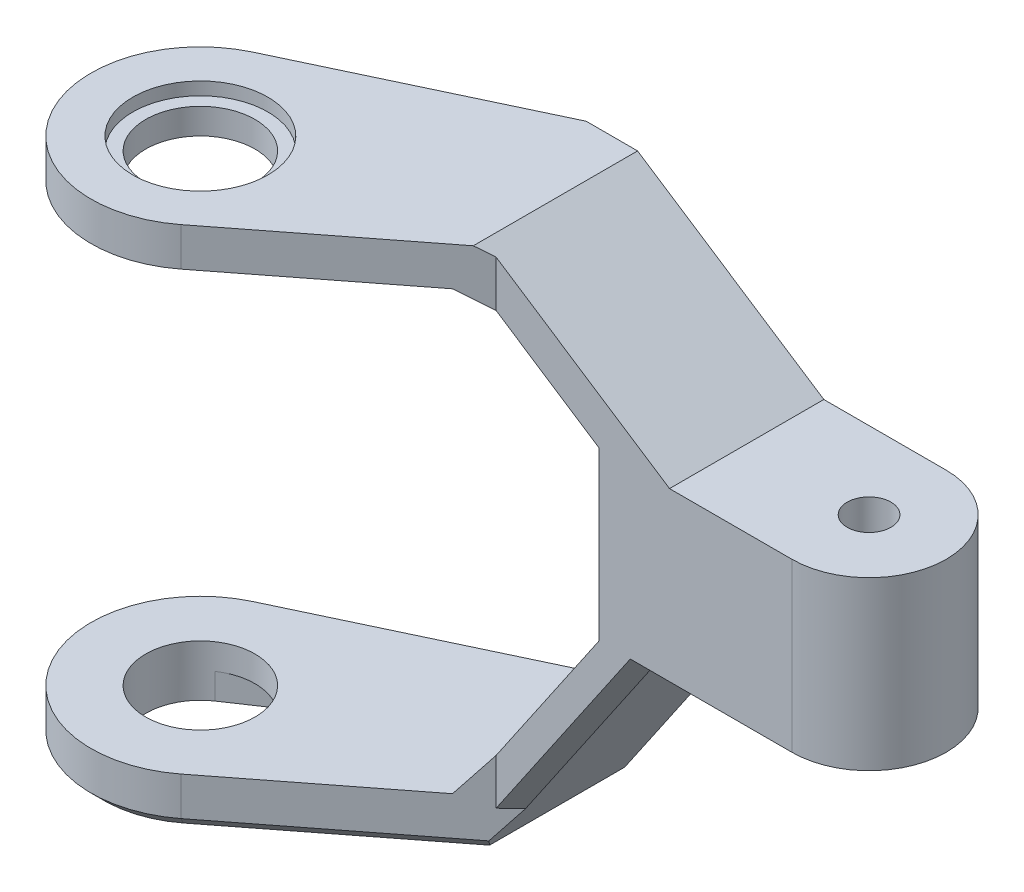
ISO-10303-21;
HEADER;
FILE_DESCRIPTION(('STEP AP214'),'2;1');
FILE_NAME('part.step','',(''),(''),'','','');
FILE_SCHEMA(('AUTOMOTIVE_DESIGN { 1 0 10303 214 1 1 1 1 }'));
ENDSEC;
DATA;
#1=APPLICATION_CONTEXT('core data for automotive mechanical design processes');
#2=APPLICATION_PROTOCOL_DEFINITION('international standard','automotive_design',2000,#1);
#3=PRODUCT_CONTEXT('',#1,'mechanical');
#4=PRODUCT('Part','Part','',(#3));
#5=PRODUCT_RELATED_PRODUCT_CATEGORY('part','',(#4));
#6=PRODUCT_DEFINITION_FORMATION('','',#4);
#7=PRODUCT_DEFINITION_CONTEXT('part definition',#1,'design');
#8=PRODUCT_DEFINITION('design','',#6,#7);
#9=PRODUCT_DEFINITION_SHAPE('','',#8);
#10=(LENGTH_UNIT() NAMED_UNIT(*) SI_UNIT(.MILLI.,.METRE.));
#11=(NAMED_UNIT(*) PLANE_ANGLE_UNIT() SI_UNIT($,.RADIAN.));
#12=(NAMED_UNIT(*) SI_UNIT($,.STERADIAN.) SOLID_ANGLE_UNIT());
#13=UNCERTAINTY_MEASURE_WITH_UNIT(LENGTH_MEASURE(1.E-05),#10,'distance_accuracy_value','');
#14=(GEOMETRIC_REPRESENTATION_CONTEXT(3) GLOBAL_UNCERTAINTY_ASSIGNED_CONTEXT((#13)) GLOBAL_UNIT_ASSIGNED_CONTEXT((#10,
#11,#12)) REPRESENTATION_CONTEXT('',''));
#15=CARTESIAN_POINT('',(0.,0.,0.));
#16=DIRECTION('',(0.,0.,1.));
#17=DIRECTION('',(1.,0.,0.));
#18=AXIS2_PLACEMENT_3D('',#15,#16,#17);
#19=CARTESIAN_POINT('',(49.900014042132,-49.,10.106834169285));
#20=DIRECTION('',(0.,1.,0.));
#21=DIRECTION('',(0.,0.,1.));
#22=AXIS2_PLACEMENT_3D('',#19,#20,#21);
#23=PLANE('',#22);
#24=DIRECTION('',(0.829311361307915,0.,-0.558786780449943));
#25=VECTOR('',#24,1.);
#26=CARTESIAN_POINT('',(44.625156285237,-49.,3.475426645614));
#27=LINE('',#26,#25);
#28=CARTESIAN_POINT('',(60.3328906864063,-49.,-7.10838390335701));
#29=VERTEX_POINT('',#28);
#30=CARTESIAN_POINT('',(44.6251562341624,-49.,3.47542668002775));
#31=VERTEX_POINT('',#30);
#32=EDGE_CURVE('E101',#29,#31,#27,.F.);
#33=ORIENTED_EDGE('',*,*,#32,.F.);
#34=CARTESIAN_POINT('',(61.869554980204,-49.,-4.827778096105));
#35=DIRECTION('',(0.,1.,0.));
#36=DIRECTION('',(0.,0.,1.));
#37=AXIS2_PLACEMENT_3D('',#34,#35,#36);
#38=CIRCLE('',#37,2.75);
#39=CARTESIAN_POINT('',(63.7460363501863,-49.,-2.81747521640199));
#40=VERTEX_POINT('',#39);
#41=EDGE_CURVE('E18',#29,#40,#38,.F.);
#42=ORIENTED_EDGE('',*,*,#41,.T.);
#43=DIRECTION('',(0.73101957657582,0.,-0.682356489426831));
#44=VECTOR('',#43,1.);
#45=CARTESIAN_POINT('',(49.900014042132,-49.,10.106834169271));
#46=LINE('',#45,#44);
#47=CARTESIAN_POINT('',(49.9000145610962,-49.,10.1068336848607));
#48=VERTEX_POINT('',#47);
#49=EDGE_CURVE('E105',#40,#48,#46,.F.);
#50=ORIENTED_EDGE('',*,*,#49,.T.);
#51=CARTESIAN_POINT('',(47.,-49.,7.));
#52=DIRECTION('',(0.,1.,0.));
#53=DIRECTION('',(0.,0.,1.));
#54=AXIS2_PLACEMENT_3D('',#51,#52,#53);
#55=CIRCLE('',#54,4.25);
#56=EDGE_CURVE('E187',#48,#31,#55,.T.);
#57=ORIENTED_EDGE('',*,*,#56,.T.);
#58=EDGE_LOOP('',(#33,#42,#50,#57));
#59=FACE_BOUND('',#58,.T.);
#60=ADVANCED_FACE('F15',(#59),#23,.F.);
#61=CARTESIAN_POINT('',(47.,-50.0000000000001,7.));
#62=DIRECTION('',(0.,1.,0.));
#63=DIRECTION('',(-1.,0.,0.));
#64=AXIS2_PLACEMENT_3D('',#61,#62,#63);
#65=CONICAL_SURFACE('',#64,8.49999999999988,0.785398163397001);
#66=CARTESIAN_POINT('',(47.,-51.0000000000004,7.));
#67=DIRECTION('',(0.,1.,0.));
#68=DIRECTION('',(-1.,0.,0.));
#69=AXIS2_PLACEMENT_3D('',#66,#67,#68);
#70=CIRCLE('',#69,7.50000000000047);
#71=CARTESIAN_POINT('',(51.6020230968271,-51.0000000000004,12.9221097099196));
#72=VERTEX_POINT('',#71);
#73=CARTESIAN_POINT('',(43.8009711672825,-51.0000000000004,0.216474771371552));
#74=VERTEX_POINT('',#73);
#75=EDGE_CURVE('E184',#72,#74,#70,.F.);
#76=ORIENTED_EDGE('',*,*,#75,.F.);
#77=DIRECTION('',(0.43388289852579,0.707106781186427,0.558341857975049));
#78=VECTOR('',#77,1.);
#79=CARTESIAN_POINT('',(51.6020230968277,-51.0000000000044,12.9221097099195));
#80=LINE('',#79,#78);
#81=CARTESIAN_POINT('',(52.2156261764027,-50.0000000000011,13.7117243379059));
#82=VERTEX_POINT('',#81);
#83=EDGE_CURVE('E117',#72,#82,#80,.T.);
#84=ORIENTED_EDGE('',*,*,#83,.T.);
#85=CARTESIAN_POINT('',(47.,-50.,7.));
#86=DIRECTION('',(0.,-1.,0.));
#87=DIRECTION('',(0.,0.,-1.));
#88=AXIS2_PLACEMENT_3D('',#85,#86,#87);
#89=CIRCLE('',#88,8.5);
#90=CARTESIAN_POINT('',(43.374433989587,-50.,-0.687995259112939));
#91=VERTEX_POINT('',#90);
#92=EDGE_CURVE('E189',#91,#82,#89,.F.);
#93=ORIENTED_EDGE('',*,*,#92,.F.);
#94=DIRECTION('',(-0.301607330777018,0.707106781186316,-0.63955689193526));
#95=VECTOR('',#94,1.);
#96=CARTESIAN_POINT('',(43.800971167283,-50.9999999999999,0.216474771371081));
#97=LINE('',#96,#95);
#98=EDGE_CURVE('E194',#74,#91,#97,.T.);
#99=ORIENTED_EDGE('',*,*,#98,.F.);
#100=EDGE_LOOP('',(#76,#84,#93,#99));
#101=FACE_BOUND('',#100,.T.);
#102=ADVANCED_FACE('F355',(#101),#65,.T.);
#103=CARTESIAN_POINT('',(61.869554980204,-49.,-4.827778096105));
#104=DIRECTION('',(0.,1.,0.));
#105=DIRECTION('',(0.,0.,1.));
#106=AXIS2_PLACEMENT_3D('',#103,#104,#105);
#107=CYLINDRICAL_SURFACE('',#106,2.75);
#108=DIRECTION('',(0.,1.,0.));
#109=VECTOR('',#108,1.);
#110=CARTESIAN_POINT('',(60.3328900388362,-49.,-7.10838346702678));
#111=LINE('',#110,#109);
#112=CARTESIAN_POINT('',(60.332890686401,-51.,-7.10838390336348));
#113=VERTEX_POINT('',#112);
#114=EDGE_CURVE('E125',#113,#29,#111,.T.);
#115=ORIENTED_EDGE('',*,*,#114,.F.);
#116=CARTESIAN_POINT('',(61.869554980204,-51.,-4.827778096105));
#117=DIRECTION('',(0.,1.,0.));
#118=DIRECTION('',(0.,0.,1.));
#119=AXIS2_PLACEMENT_3D('',#116,#117,#118);
#120=CIRCLE('',#119,2.75);
#121=CARTESIAN_POINT('',(63.7460363501829,-51.,-2.81747521640638));
#122=VERTEX_POINT('',#121);
#123=EDGE_CURVE('E113',#122,#113,#120,.T.);
#124=ORIENTED_EDGE('',*,*,#123,.F.);
#125=DIRECTION('',(0.,1.,0.));
#126=VECTOR('',#125,1.);
#127=CARTESIAN_POINT('',(63.746037374241,-49.,-2.81747617228661));
#128=LINE('',#127,#126);
#129=EDGE_CURVE('E110',#122,#40,#128,.T.);
#130=ORIENTED_EDGE('',*,*,#129,.T.);
#131=ORIENTED_EDGE('',*,*,#41,.F.);
#132=EDGE_LOOP('',(#115,#124,#130,#131));
#133=FACE_BOUND('',#132,.T.);
#134=ADVANCED_FACE('F111',(#133),#107,.F.);
#135=CARTESIAN_POINT('',(44.625156285237,-49.,3.475426645614));
#136=DIRECTION('',(0.558786780449943,0.,0.829311361307915));
#137=DIRECTION('',(0.829311361307915,0.,-0.558786780449943));
#138=AXIS2_PLACEMENT_3D('',#135,#136,#137);
#139=PLANE('',#138);
#140=DIRECTION('',(-0.829311361307587,0.,0.55878678045043));
#141=VECTOR('',#140,1.);
#142=CARTESIAN_POINT('',(60.33289003883,-51.,-7.108383467036));
#143=LINE('',#142,#141);
#144=CARTESIAN_POINT('',(44.6251562341614,-51.,3.47542668002845));
#145=VERTEX_POINT('',#144);
#146=EDGE_CURVE('E181',#113,#145,#143,.T.);
#147=ORIENTED_EDGE('',*,*,#146,.F.);
#148=ORIENTED_EDGE('',*,*,#114,.T.);
#149=ORIENTED_EDGE('',*,*,#32,.T.);
#150=DIRECTION('',(0.,1.,0.));
#151=VECTOR('',#150,1.);
#152=CARTESIAN_POINT('',(44.6251562852368,-45.,3.47542664561372));
#153=LINE('',#152,#151);
#154=EDGE_CURVE('E122',#31,#145,#153,.F.);
#155=ORIENTED_EDGE('',*,*,#154,.T.);
#156=EDGE_LOOP('',(#147,#148,#149,#155));
#157=FACE_BOUND('',#156,.T.);
#158=ADVANCED_FACE('F899',(#157),#139,.T.);
#159=CARTESIAN_POINT('',(49.900014042132,-49.,10.106834169271));
#160=DIRECTION('',(0.682356489426831,0.,0.73101957657582));
#161=DIRECTION('',(0.73101957657582,0.,-0.682356489426831));
#162=AXIS2_PLACEMENT_3D('',#159,#160,#161);
#163=PLANE('',#162);
#164=DIRECTION('',(0.731019576575566,0.,-0.682356489427103));
#165=VECTOR('',#164,1.);
#166=CARTESIAN_POINT('',(49.900015080058,-51.,10.106833200438));
#167=LINE('',#166,#165);
#168=CARTESIAN_POINT('',(49.9000145610931,-51.,10.1068336848562));
#169=VERTEX_POINT('',#168);
#170=EDGE_CURVE('E180',#169,#122,#167,.T.);
#171=ORIENTED_EDGE('',*,*,#170,.F.);
#172=DIRECTION('',(0.,1.,0.));
#173=VECTOR('',#172,1.);
#174=CARTESIAN_POINT('',(49.9000140421285,-49.,10.1068341692743));
#175=LINE('',#174,#173);
#176=EDGE_CURVE('E118',#48,#169,#175,.F.);
#177=ORIENTED_EDGE('',*,*,#176,.F.);
#178=ORIENTED_EDGE('',*,*,#49,.F.);
#179=ORIENTED_EDGE('',*,*,#129,.F.);
#180=EDGE_LOOP('',(#171,#177,#178,#179));
#181=FACE_BOUND('',#180,.T.);
#182=ADVANCED_FACE('F121',(#181),#163,.F.);
#183=CARTESIAN_POINT('',(64.693198460212,-50.5,3.382284520207));
#184=DIRECTION('',(-0.433882898525796,0.707106781186668,-0.558341857974738));
#185=DIRECTION('',(0.,0.61971243069763,0.784828964322058));
#186=AXIS2_PLACEMENT_3D('',#183,#184,#185);
#187=PLANE('',#186);
#188=ORIENTED_EDGE('',*,*,#83,.F.);
#189=DIRECTION('',(-0.78961462798895,0.,0.613603079576587));
#190=VECTOR('',#189,1.);
#191=CARTESIAN_POINT('',(65.,-51.,2.510651263633));
#192=LINE('',#191,#190);
#193=CARTESIAN_POINT('',(65.0000000000008,-51.0000000000005,2.51065126363294));
#194=VERTEX_POINT('',#193);
#195=EDGE_CURVE('E186',#194,#72,#192,.T.);
#196=ORIENTED_EDGE('',*,*,#195,.F.);
#197=DIRECTION('',(-0.482241499205886,-0.705732715213269,-0.519022611377737));
#198=VECTOR('',#197,1.);
#199=CARTESIAN_POINT('',(65.6833203120842,-50.0000000000015,3.24608919953901));
#200=LINE('',#199,#198);
#201=CARTESIAN_POINT('',(65.6833203120807,-50.0000000000005,3.24608919953644));
#202=VERTEX_POINT('',#201);
#203=EDGE_CURVE('E188',#202,#194,#200,.T.);
#204=ORIENTED_EDGE('',*,*,#203,.F.);
#205=DIRECTION('',(-0.789614627988769,0.,0.613603079576821));
#206=VECTOR('',#205,1.);
#207=CARTESIAN_POINT('',(52.215626176402,-50.,13.711724337905));
#208=LINE('',#207,#206);
#209=EDGE_CURVE('E236',#202,#82,#208,.T.);
#210=ORIENTED_EDGE('',*,*,#209,.T.);
#211=EDGE_LOOP('',(#188,#196,#204,#210));
#212=FACE_BOUND('',#211,.T.);
#213=ADVANCED_FACE('F361',(#212),#187,.F.);
#214=CARTESIAN_POINT('',(43.587702578435,-50.5,-0.235760243871));
#215=DIRECTION('',(-0.301607330776906,-0.707106781186779,-0.639556891934801));
#216=DIRECTION('',(0.,0.670794285658608,-0.741643463078963));
#217=AXIS2_PLACEMENT_3D('',#214,#215,#216);
#218=PLANE('',#217);
#219=DIRECTION('',(0.904470030483785,0.,-0.426537177695755));
#220=VECTOR('',#219,1.);
#221=CARTESIAN_POINT('',(43.800971167283,-51.,0.216474771371));
#222=LINE('',#221,#220);
#223=CARTESIAN_POINT('',(61.2239663375465,-51.0000000000008,-8.00000000000072));
#224=VERTEX_POINT('',#223);
#225=EDGE_CURVE('E183',#74,#224,#222,.T.);
#226=ORIENTED_EDGE('',*,*,#225,.F.);
#227=ORIENTED_EDGE('',*,*,#98,.T.);
#228=DIRECTION('',(-0.90447003048373,0.,0.426537177695873));
#229=VECTOR('',#228,1.);
#230=CARTESIAN_POINT('',(43.374433989587,-50.,-0.687995259112998));
#231=LINE('',#230,#229);
#232=CARTESIAN_POINT('',(60.9999999999994,-50.0000000000007,-9.00000000000128));
#233=VERTEX_POINT('',#232);
#234=EDGE_CURVE('E376',#233,#91,#231,.T.);
#235=ORIENTED_EDGE('',*,*,#234,.F.);
#236=DIRECTION('',(0.156418736237812,-0.698402884785367,0.698402884785883));
#237=VECTOR('',#236,1.);
#238=CARTESIAN_POINT('',(60.9999999999988,-50.0000000000028,-9.00000000000252));
#239=LINE('',#238,#237);
#240=EDGE_CURVE('E202',#233,#224,#239,.T.);
#241=ORIENTED_EDGE('',*,*,#240,.T.);
#242=EDGE_LOOP('',(#226,#227,#235,#241));
#243=FACE_BOUND('',#242,.T.);
#244=ADVANCED_FACE('F624',(#243),#218,.T.);
#245=CARTESIAN_POINT('',(47.,-55.,7.));
#246=DIRECTION('',(0.,-1.,0.));
#247=DIRECTION('',(0.,0.,-1.));
#248=AXIS2_PLACEMENT_3D('',#245,#246,#247);
#249=CYLINDRICAL_SURFACE('',#248,8.5);
#250=DIRECTION('',(0.,1.,0.));
#251=VECTOR('',#250,1.);
#252=CARTESIAN_POINT('',(52.215626176402,-55.,13.711724337905));
#253=LINE('',#252,#251);
#254=CARTESIAN_POINT('',(52.2156261764014,-47.,13.7117243379055));
#255=VERTEX_POINT('',#254);
#256=EDGE_CURVE('E220',#82,#255,#253,.T.);
#257=ORIENTED_EDGE('',*,*,#256,.T.);
#258=CARTESIAN_POINT('',(47.,-47.,7.));
#259=DIRECTION('',(0.,-1.,0.));
#260=DIRECTION('',(0.,0.,-1.));
#261=AXIS2_PLACEMENT_3D('',#258,#259,#260);
#262=CIRCLE('',#261,8.5);
#263=CARTESIAN_POINT('',(43.3744339895865,-47.,-0.687995259112779));
#264=VERTEX_POINT('',#263);
#265=EDGE_CURVE('E173',#264,#255,#262,.F.);
#266=ORIENTED_EDGE('',*,*,#265,.F.);
#267=DIRECTION('',(0.,1.,0.));
#268=VECTOR('',#267,1.);
#269=CARTESIAN_POINT('',(43.374433989587,-55.,-0.687995259113));
#270=LINE('',#269,#268);
#271=EDGE_CURVE('E375',#91,#264,#270,.T.);
#272=ORIENTED_EDGE('',*,*,#271,.F.);
#273=ORIENTED_EDGE('',*,*,#92,.T.);
#274=EDGE_LOOP('',(#257,#266,#272,#273));
#275=FACE_BOUND('',#274,.T.);
#276=ADVANCED_FACE('F625',(#275),#249,.T.);
#277=CARTESIAN_POINT('',(47.,-45.,7.));
#278=DIRECTION('',(0.,1.,0.));
#279=DIRECTION('',(0.,0.,1.));
#280=AXIS2_PLACEMENT_3D('',#277,#278,#279);
#281=CYLINDRICAL_SURFACE('',#280,4.25);
#282=ORIENTED_EDGE('',*,*,#154,.F.);
#283=ORIENTED_EDGE('',*,*,#56,.F.);
#284=ORIENTED_EDGE('',*,*,#176,.T.);
#285=CARTESIAN_POINT('',(47.,-51.,7.));
#286=DIRECTION('',(0.,1.,0.));
#287=DIRECTION('',(0.,0.,1.));
#288=AXIS2_PLACEMENT_3D('',#285,#286,#287);
#289=CIRCLE('',#288,4.25);
#290=EDGE_CURVE('E177',#145,#169,#289,.T.);
#291=ORIENTED_EDGE('',*,*,#290,.F.);
#292=EDGE_LOOP('',(#282,#283,#284,#291));
#293=FACE_BOUND('',#292,.T.);
#294=CARTESIAN_POINT('',(47.,-47.,7.));
#295=DIRECTION('',(0.,1.,0.));
#296=DIRECTION('',(0.,0.,1.));
#297=AXIS2_PLACEMENT_3D('',#294,#295,#296);
#298=CIRCLE('',#297,4.25);
#299=CARTESIAN_POINT('',(47.,-47.,11.25));
#300=VERTEX_POINT('',#299);
#301=EDGE_CURVE('E168',#300,#300,#298,.F.);
#302=ORIENTED_EDGE('',*,*,#301,.F.);
#303=EDGE_LOOP('',(#302));
#304=FACE_BOUND('',#303,.T.);
#305=ADVANCED_FACE('F627',(#293,#304),#281,.F.);
#306=CARTESIAN_POINT('',(89.,-55.,-3.));
#307=DIRECTION('',(0.,-1.,0.));
#308=DIRECTION('',(0.,0.,-1.));
#309=AXIS2_PLACEMENT_3D('',#306,#307,#308);
#310=CYLINDRICAL_SURFACE('',#309,1.7);
#311=CARTESIAN_POINT('',(89.,-19.5,-2.99999999999999));
#312=DIRECTION('',(0.,-1.,0.));
#313=DIRECTION('',(0.,0.,-1.));
#314=AXIS2_PLACEMENT_3D('',#311,#312,#313);
#315=CIRCLE('',#314,1.7);
#316=CARTESIAN_POINT('',(89.,-19.5,-4.69999999999999));
#317=VERTEX_POINT('',#316);
#318=EDGE_CURVE('E164',#317,#317,#315,.T.);
#319=ORIENTED_EDGE('',*,*,#318,.F.);
#320=EDGE_LOOP('',(#319));
#321=FACE_BOUND('',#320,.T.);
#322=CARTESIAN_POINT('',(89.,-32.5,-2.99999999999999));
#323=DIRECTION('',(0.,-1.,0.));
#324=DIRECTION('',(0.,0.,-1.));
#325=AXIS2_PLACEMENT_3D('',#322,#323,#324);
#326=CIRCLE('',#325,1.7);
#327=CARTESIAN_POINT('',(89.,-32.5,-4.69999999999999));
#328=VERTEX_POINT('',#327);
#329=EDGE_CURVE('E152',#328,#328,#326,.F.);
#330=ORIENTED_EDGE('',*,*,#329,.F.);
#331=EDGE_LOOP('',(#330));
#332=FACE_BOUND('',#331,.T.);
#333=ADVANCED_FACE('F634',(#321,#332),#310,.F.);
#334=CARTESIAN_POINT('',(77.641425773517,-32.5,-20.));
#335=DIRECTION('',(0.825649649504588,-0.564183176169718,0.));
#336=DIRECTION('',(0.564183176169718,0.825649649504588,0.));
#337=AXIS2_PLACEMENT_3D('',#334,#335,#336);
#338=PLANE('',#337);
#339=DIRECTION('',(-0.516705432733949,-0.756168700974286,0.401527572465557));
#340=VECTOR('',#339,1.);
#341=CARTESIAN_POINT('',(67.2868491933448,-47.65332765188,1.99999999999585));
#342=LINE('',#341,#340);
#343=CARTESIAN_POINT('',(67.2868491933475,-47.6533276518805,1.9999999999994));
#344=VERTEX_POINT('',#343);
#345=EDGE_CURVE('E216',#344,#202,#342,.T.);
#346=ORIENTED_EDGE('',*,*,#345,.T.);
#347=ORIENTED_EDGE('',*,*,#203,.T.);
#348=DIRECTION('',(0.,0.,-1.));
#349=VECTOR('',#348,1.);
#350=CARTESIAN_POINT('',(65.,-51.,-20.));
#351=LINE('',#350,#349);
#352=CARTESIAN_POINT('',(65.0000000000004,-51.,-7.99999999999985));
#353=VERTEX_POINT('',#352);
#354=EDGE_CURVE('E191',#353,#194,#351,.F.);
#355=ORIENTED_EDGE('',*,*,#354,.F.);
#356=DIRECTION('',(-0.564183176169779,-0.825649649504546,0.));
#357=VECTOR('',#356,1.);
#358=CARTESIAN_POINT('',(77.6414257735151,-32.4999999999987,-7.99999999999771));
#359=LINE('',#358,#357);
#360=CARTESIAN_POINT('',(77.6414257735166,-32.4999999999996,-7.99999999999942));
#361=VERTEX_POINT('',#360);
#362=EDGE_CURVE('E259',#361,#353,#359,.T.);
#363=ORIENTED_EDGE('',*,*,#362,.F.);
#364=DIRECTION('',(0.,0.,-1.));
#365=VECTOR('',#364,1.);
#366=CARTESIAN_POINT('',(77.641425773517,-32.5,-20.));
#367=LINE('',#366,#365);
#368=CARTESIAN_POINT('',(77.6414257735153,-32.4999999999987,1.99999999999788));
#369=VERTEX_POINT('',#368);
#370=EDGE_CURVE('E160',#369,#361,#367,.T.);
#371=ORIENTED_EDGE('',*,*,#370,.F.);
#372=DIRECTION('',(-0.564183176169883,-0.825649649504476,1.7507238425968E-13));
#373=VECTOR('',#372,1.);
#374=CARTESIAN_POINT('',(77.6414257735153,-32.4999999999988,1.99999999999788));
#375=LINE('',#374,#373);
#376=EDGE_CURVE('E219',#369,#344,#375,.T.);
#377=ORIENTED_EDGE('',*,*,#376,.T.);
#378=EDGE_LOOP('',(#346,#347,#355,#363,#371,#377));
#379=FACE_BOUND('',#378,.T.);
#380=ADVANCED_FACE('F619',(#379),#338,.T.);
#381=CARTESIAN_POINT('',(65.,-51.,-20.));
#382=DIRECTION('',(0.,-1.,0.));
#383=DIRECTION('',(0.,0.,-1.));
#384=AXIS2_PLACEMENT_3D('',#381,#382,#383);
#385=PLANE('',#384);
#386=ORIENTED_EDGE('',*,*,#290,.T.);
#387=ORIENTED_EDGE('',*,*,#170,.T.);
#388=ORIENTED_EDGE('',*,*,#123,.T.);
#389=ORIENTED_EDGE('',*,*,#146,.T.);
#390=EDGE_LOOP('',(#386,#387,#388,#389));
#391=FACE_BOUND('',#390,.T.);
#392=ORIENTED_EDGE('',*,*,#225,.T.);
#393=DIRECTION('',(1.,0.,0.));
#394=VECTOR('',#393,1.);
#395=CARTESIAN_POINT('',(61.,-51.,-8.));
#396=LINE('',#395,#394);
#397=EDGE_CURVE('E248',#353,#224,#396,.F.);
#398=ORIENTED_EDGE('',*,*,#397,.F.);
#399=ORIENTED_EDGE('',*,*,#354,.T.);
#400=ORIENTED_EDGE('',*,*,#195,.T.);
#401=ORIENTED_EDGE('',*,*,#75,.T.);
#402=EDGE_LOOP('',(#392,#398,#399,#400,#401));
#403=FACE_BOUND('',#402,.T.);
#404=ADVANCED_FACE('F621',(#391,#403),#385,.T.);
#405=CARTESIAN_POINT('',(52.215626176402,-55.,13.711724337905));
#406=DIRECTION('',(-0.613603079576821,0.,-0.789614627988769));
#407=DIRECTION('',(-0.789614627988769,0.,0.613603079576821));
#408=AXIS2_PLACEMENT_3D('',#405,#406,#407);
#409=PLANE('',#408);
#410=DIRECTION('',(-0.787797471277513,-0.0678037306375619,0.61219098193324));
#411=VECTOR('',#410,1.);
#412=CARTESIAN_POINT('',(67.2868491933489,-47.6533276518806,2.00000000000109));
#413=LINE('',#412,#411);
#414=CARTESIAN_POINT('',(65.9999999999999,-47.7640834987299,2.9999999999999));
#415=VERTEX_POINT('',#414);
#416=EDGE_CURVE('E225',#344,#415,#413,.T.);
#417=ORIENTED_EDGE('',*,*,#416,.T.);
#418=DIRECTION('',(0.,1.,0.));
#419=VECTOR('',#418,1.);
#420=CARTESIAN_POINT('',(66.,-55.,3.));
#421=LINE('',#420,#419);
#422=CARTESIAN_POINT('',(66.0000000000003,-44.2075401660802,3.00000000000001));
#423=VERTEX_POINT('',#422);
#424=EDGE_CURVE('E417',#415,#423,#421,.T.);
#425=ORIENTED_EDGE('',*,*,#424,.T.);
#426=DIRECTION('',(0.51670543273532,0.756168700972921,-0.401527572466364));
#427=VECTOR('',#426,1.);
#428=CARTESIAN_POINT('',(64.091855474811,-47.,4.48280352900201));
#429=LINE('',#428,#427);
#430=CARTESIAN_POINT('',(64.091855474811,-47.,4.48280352900201));
#431=VERTEX_POINT('',#430);
#432=EDGE_CURVE('E397',#431,#423,#429,.T.);
#433=ORIENTED_EDGE('',*,*,#432,.F.);
#434=DIRECTION('',(0.789614627988952,0.,-0.613603079576586));
#435=VECTOR('',#434,1.);
#436=CARTESIAN_POINT('',(52.215626176402,-47.,13.711724337905));
#437=LINE('',#436,#435);
#438=EDGE_CURVE('E172',#255,#431,#437,.T.);
#439=ORIENTED_EDGE('',*,*,#438,.F.);
#440=ORIENTED_EDGE('',*,*,#256,.F.);
#441=ORIENTED_EDGE('',*,*,#209,.F.);
#442=ORIENTED_EDGE('',*,*,#345,.F.);
#443=EDGE_LOOP('',(#417,#425,#433,#439,#440,#441,#442));
#444=FACE_BOUND('',#443,.T.);
#445=ADVANCED_FACE('F364',(#444),#409,.F.);
#446=CARTESIAN_POINT('',(65.587175175248,-49.25446589115,2.5));
#447=DIRECTION('',(-0.583822466048804,0.398937749700866,-0.707106781186762));
#448=DIRECTION('',(-0.771127304077281,0.,0.636680988334428));
#449=AXIS2_PLACEMENT_3D('',#446,#447,#448);
#450=PLANE('',#449);
#451=ORIENTED_EDGE('',*,*,#376,.F.);
#452=DIRECTION('',(0.771127304077038,0.,-0.636680988334723));
#453=VECTOR('',#452,1.);
#454=CARTESIAN_POINT('',(76.430258300001,-32.5,3.));
#455=LINE('',#454,#453);
#456=CARTESIAN_POINT('',(76.4302583000005,-32.4999999999996,2.99999999999938));
#457=VERTEX_POINT('',#456);
#458=EDGE_CURVE('E156',#457,#369,#455,.T.);
#459=ORIENTED_EDGE('',*,*,#458,.F.);
#460=DIRECTION('',(-0.564183176169935,-0.825649649504439,0.));
#461=VECTOR('',#460,1.);
#462=CARTESIAN_POINT('',(76.430258300001,-32.5,3.00000000000001));
#463=LINE('',#462,#461);
#464=EDGE_CURVE('E407',#457,#415,#463,.T.);
#465=ORIENTED_EDGE('',*,*,#464,.T.);
#466=ORIENTED_EDGE('',*,*,#416,.F.);
#467=EDGE_LOOP('',(#451,#459,#465,#466));
#468=FACE_BOUND('',#467,.T.);
#469=ADVANCED_FACE('F693',(#468),#450,.F.);
#470=CARTESIAN_POINT('',(47.,-11.,7.));
#471=DIRECTION('',(0.,1.,0.));
#472=DIRECTION('',(0.,0.,1.));
#473=AXIS2_PLACEMENT_3D('',#470,#471,#472);
#474=CYLINDRICAL_SURFACE('',#473,5.25);
#475=CARTESIAN_POINT('',(47.,-11.,7.));
#476=DIRECTION('',(0.,1.,0.));
#477=DIRECTION('',(0.,0.,1.));
#478=AXIS2_PLACEMENT_3D('',#475,#476,#477);
#479=CIRCLE('',#478,5.25);
#480=CARTESIAN_POINT('',(47.,-11.,12.25));
#481=VERTEX_POINT('',#480);
#482=EDGE_CURVE('E144',#481,#481,#479,.T.);
#483=ORIENTED_EDGE('',*,*,#482,.F.);
#484=EDGE_LOOP('',(#483));
#485=FACE_BOUND('',#484,.T.);
#486=CARTESIAN_POINT('',(47.,-10.,7.));
#487=DIRECTION('',(0.,1.,0.));
#488=DIRECTION('',(0.,0.,1.));
#489=AXIS2_PLACEMENT_3D('',#486,#487,#488);
#490=CIRCLE('',#489,5.25);
#491=CARTESIAN_POINT('',(47.,-10.,12.25));
#492=VERTEX_POINT('',#491);
#493=EDGE_CURVE('E148',#492,#492,#490,.F.);
#494=ORIENTED_EDGE('',*,*,#493,.F.);
#495=EDGE_LOOP('',(#494));
#496=FACE_BOUND('',#495,.T.);
#497=ADVANCED_FACE('F690',(#485,#496),#474,.F.);
#498=CARTESIAN_POINT('',(43.374433989587,-55.,-0.687995259113));
#499=DIRECTION('',(-0.426537177695873,0.,-0.90447003048373));
#500=DIRECTION('',(-0.90447003048373,0.,0.426537177695873));
#501=AXIS2_PLACEMENT_3D('',#498,#499,#500);
#502=PLANE('',#501);
#503=ORIENTED_EDGE('',*,*,#271,.T.);
#504=DIRECTION('',(-0.904470030483793,0.,0.426537177695739));
#505=VECTOR('',#504,1.);
#506=CARTESIAN_POINT('',(61.,-47.,-9.));
#507=LINE('',#506,#505);
#508=CARTESIAN_POINT('',(61.,-47.,-9.));
#509=VERTEX_POINT('',#508);
#510=EDGE_CURVE('E176',#509,#264,#507,.T.);
#511=ORIENTED_EDGE('',*,*,#510,.F.);
#512=DIRECTION('',(0.,1.,0.));
#513=VECTOR('',#512,1.);
#514=CARTESIAN_POINT('',(61.,-55.,-9.));
#515=LINE('',#514,#513);
#516=EDGE_CURVE('E147',#233,#509,#515,.T.);
#517=ORIENTED_EDGE('',*,*,#516,.F.);
#518=ORIENTED_EDGE('',*,*,#234,.T.);
#519=EDGE_LOOP('',(#503,#511,#517,#518));
#520=FACE_BOUND('',#519,.T.);
#521=ADVANCED_FACE('F498',(#520),#502,.T.);
#522=CARTESIAN_POINT('',(36.,-47.,-20.));
#523=DIRECTION('',(0.,1.,0.));
#524=DIRECTION('',(0.,0.,1.));
#525=AXIS2_PLACEMENT_3D('',#522,#523,#524);
#526=PLANE('',#525);
#527=ORIENTED_EDGE('',*,*,#301,.T.);
#528=EDGE_LOOP('',(#527));
#529=FACE_BOUND('',#528,.T.);
#530=ORIENTED_EDGE('',*,*,#265,.T.);
#531=ORIENTED_EDGE('',*,*,#438,.T.);
#532=DIRECTION('',(0.,0.,1.));
#533=VECTOR('',#532,1.);
#534=CARTESIAN_POINT('',(64.091855474811,-47.,-20.));
#535=LINE('',#534,#533);
#536=CARTESIAN_POINT('',(64.091855474811,-47.,-9.));
#537=VERTEX_POINT('',#536);
#538=EDGE_CURVE('E171',#537,#431,#535,.T.);
#539=ORIENTED_EDGE('',*,*,#538,.F.);
#540=DIRECTION('',(1.,0.,0.));
#541=VECTOR('',#540,1.);
#542=CARTESIAN_POINT('',(61.,-47.,-9.));
#543=LINE('',#542,#541);
#544=EDGE_CURVE('E480',#509,#537,#543,.T.);
#545=ORIENTED_EDGE('',*,*,#544,.F.);
#546=ORIENTED_EDGE('',*,*,#510,.T.);
#547=EDGE_LOOP('',(#530,#531,#539,#545,#546));
#548=FACE_BOUND('',#547,.T.);
#549=ADVANCED_FACE('F500',(#529,#548),#526,.T.);
#550=CARTESIAN_POINT('',(64.091855474811,-47.,-20.));
#551=DIRECTION('',(-0.825649649504588,0.564183176169718,0.));
#552=DIRECTION('',(-0.564183176169718,-0.825649649504588,0.));
#553=AXIS2_PLACEMENT_3D('',#550,#551,#552);
#554=PLANE('',#553);
#555=DIRECTION('',(0.564183176169901,0.825649649504463,0.));
#556=VECTOR('',#555,1.);
#557=CARTESIAN_POINT('',(66.,-44.20754016608,3.));
#558=LINE('',#557,#556);
#559=CARTESIAN_POINT('',(74.,-32.5,3.00000000000001));
#560=VERTEX_POINT('',#559);
#561=EDGE_CURVE('E414',#423,#560,#558,.T.);
#562=ORIENTED_EDGE('',*,*,#561,.T.);
#563=DIRECTION('',(0.,0.,1.));
#564=VECTOR('',#563,1.);
#565=CARTESIAN_POINT('',(74.,-32.5,-20.));
#566=LINE('',#565,#564);
#567=CARTESIAN_POINT('',(74.,-32.5,-8.99999999999999));
#568=VERTEX_POINT('',#567);
#569=EDGE_CURVE('E251',#568,#560,#566,.T.);
#570=ORIENTED_EDGE('',*,*,#569,.F.);
#571=DIRECTION('',(0.564183176169821,0.825649649504518,0.));
#572=VECTOR('',#571,1.);
#573=CARTESIAN_POINT('',(64.091855474811,-47.,-9.));
#574=LINE('',#573,#572);
#575=EDGE_CURVE('E476',#537,#568,#574,.T.);
#576=ORIENTED_EDGE('',*,*,#575,.F.);
#577=ORIENTED_EDGE('',*,*,#538,.T.);
#578=ORIENTED_EDGE('',*,*,#432,.T.);
#579=EDGE_LOOP('',(#562,#570,#576,#577,#578));
#580=FACE_BOUND('',#579,.T.);
#581=ADVANCED_FACE('F503',(#580),#554,.T.);
#582=CARTESIAN_POINT('',(65.,-10.,-20.));
#583=DIRECTION('',(0.548525495951935,0.836133829174902,0.));
#584=DIRECTION('',(-0.836133829174902,0.548525495951935,0.));
#585=AXIS2_PLACEMENT_3D('',#582,#583,#584);
#586=PLANE('',#585);
#587=DIRECTION('',(0.836133829175121,-0.5485254959516,0.));
#588=VECTOR('',#587,1.);
#589=CARTESIAN_POINT('',(66.,-10.65602595758,3.00000000000002));
#590=LINE('',#589,#588);
#591=CARTESIAN_POINT('',(65.9999999999979,-10.6560259575802,2.99999999999876));
#592=VERTEX_POINT('',#591);
#593=CARTESIAN_POINT('',(79.481134306046,-19.5,3.00000000000001));
#594=VERTEX_POINT('',#593);
#595=EDGE_CURVE('E411',#592,#594,#590,.T.);
#596=ORIENTED_EDGE('',*,*,#595,.T.);
#597=DIRECTION('',(0.,0.,1.));
#598=VECTOR('',#597,1.);
#599=CARTESIAN_POINT('',(79.481134306046,-19.5,-20.));
#600=LINE('',#599,#598);
#601=CARTESIAN_POINT('',(79.481134306046,-19.5,-8.99999999999998));
#602=VERTEX_POINT('',#601);
#603=EDGE_CURVE('E167',#602,#594,#600,.T.);
#604=ORIENTED_EDGE('',*,*,#603,.F.);
#605=DIRECTION('',(0.836133829175184,-0.548525495951505,0.));
#606=VECTOR('',#605,1.);
#607=CARTESIAN_POINT('',(65.,-10.,-8.99999999999998));
#608=LINE('',#607,#606);
#609=CARTESIAN_POINT('',(65.,-10.,-8.99999999999999));
#610=VERTEX_POINT('',#609);
#611=EDGE_CURVE('E460',#610,#602,#608,.T.);
#612=ORIENTED_EDGE('',*,*,#611,.F.);
#613=DIRECTION('',(0.,0.,1.));
#614=VECTOR('',#613,1.);
#615=CARTESIAN_POINT('',(65.,-10.,-20.));
#616=LINE('',#615,#614);
#617=CARTESIAN_POINT('',(64.9999999999991,-10.,3.77709183419967));
#618=VERTEX_POINT('',#617);
#619=EDGE_CURVE('E151',#618,#610,#616,.F.);
#620=ORIENTED_EDGE('',*,*,#619,.F.);
#621=DIRECTION('',(0.701130267075157,-0.459959654848345,-0.544842605256702));
#622=VECTOR('',#621,1.);
#623=CARTESIAN_POINT('',(65.,-10.,3.77709183420201));
#624=LINE('',#623,#622);
#625=EDGE_CURVE('E395',#618,#592,#624,.T.);
#626=ORIENTED_EDGE('',*,*,#625,.T.);
#627=EDGE_LOOP('',(#596,#604,#612,#620,#626));
#628=FACE_BOUND('',#627,.T.);
#629=ADVANCED_FACE('F571',(#628),#586,.T.);
#630=CARTESIAN_POINT('',(79.481134306045,-19.5,-20.));
#631=DIRECTION('',(0.,1.,0.));
#632=DIRECTION('',(0.,0.,1.));
#633=AXIS2_PLACEMENT_3D('',#630,#631,#632);
#634=PLANE('',#633);
#635=ORIENTED_EDGE('',*,*,#318,.T.);
#636=EDGE_LOOP('',(#635));
#637=FACE_BOUND('',#636,.T.);
#638=DIRECTION('',(1.,0.,0.));
#639=VECTOR('',#638,1.);
#640=CARTESIAN_POINT('',(66.,-19.5,3.00000000000002));
#641=LINE('',#640,#639);
#642=CARTESIAN_POINT('',(89.000000060325,-19.5,3.00000000000002));
#643=VERTEX_POINT('',#642);
#644=EDGE_CURVE('E404',#594,#643,#641,.T.);
#645=ORIENTED_EDGE('',*,*,#644,.T.);
#646=CARTESIAN_POINT('',(89.,-19.5,-2.99999999999999));
#647=DIRECTION('',(0.,-1.,0.));
#648=DIRECTION('',(0.,0.,-1.));
#649=AXIS2_PLACEMENT_3D('',#646,#647,#648);
#650=CIRCLE('',#649,6.);
#651=CARTESIAN_POINT('',(89.000000052398,-19.5,-8.99999999999998));
#652=VERTEX_POINT('',#651);
#653=EDGE_CURVE('E161',#652,#643,#650,.T.);
#654=ORIENTED_EDGE('',*,*,#653,.F.);
#655=DIRECTION('',(1.,0.,0.));
#656=VECTOR('',#655,1.);
#657=CARTESIAN_POINT('',(61.,-19.5,-8.99999999999999));
#658=LINE('',#657,#656);
#659=EDGE_CURVE('E452',#602,#652,#658,.T.);
#660=ORIENTED_EDGE('',*,*,#659,.F.);
#661=ORIENTED_EDGE('',*,*,#603,.T.);
#662=EDGE_LOOP('',(#645,#654,#660,#661));
#663=FACE_BOUND('',#662,.T.);
#664=ADVANCED_FACE('F611',(#637,#663),#634,.T.);
#665=CARTESIAN_POINT('',(89.,-55.,-3.));
#666=DIRECTION('',(0.,-1.,0.));
#667=DIRECTION('',(0.,0.,-1.));
#668=AXIS2_PLACEMENT_3D('',#665,#666,#667);
#669=CYLINDRICAL_SURFACE('',#668,6.);
#670=ORIENTED_EDGE('',*,*,#653,.T.);
#671=DIRECTION('',(0.,1.,0.));
#672=VECTOR('',#671,1.);
#673=CARTESIAN_POINT('',(89.00000012065,-55.,3.));
#674=LINE('',#673,#672);
#675=CARTESIAN_POINT('',(89.000000060325,-32.5,3.00000000000001));
#676=VERTEX_POINT('',#675);
#677=EDGE_CURVE('E400',#643,#676,#674,.F.);
#678=ORIENTED_EDGE('',*,*,#677,.T.);
#679=CARTESIAN_POINT('',(89.,-32.5,-2.99999999999999));
#680=DIRECTION('',(0.,-1.,0.));
#681=DIRECTION('',(0.,0.,-1.));
#682=AXIS2_PLACEMENT_3D('',#679,#680,#681);
#683=CIRCLE('',#682,6.);
#684=CARTESIAN_POINT('',(89.000000052398,-32.5,-8.99999999999999));
#685=VERTEX_POINT('',#684);
#686=EDGE_CURVE('E157',#685,#676,#683,.T.);
#687=ORIENTED_EDGE('',*,*,#686,.F.);
#688=DIRECTION('',(0.,1.,0.));
#689=VECTOR('',#688,1.);
#690=CARTESIAN_POINT('',(89.000000104796,-55.,-9.));
#691=LINE('',#690,#689);
#692=EDGE_CURVE('E447',#652,#685,#691,.F.);
#693=ORIENTED_EDGE('',*,*,#692,.F.);
#694=EDGE_LOOP('',(#670,#678,#687,#693));
#695=FACE_BOUND('',#694,.T.);
#696=ADVANCED_FACE('F614',(#695),#669,.T.);
#697=CARTESIAN_POINT('',(102.64142577351,-32.5,-20.));
#698=DIRECTION('',(0.,-1.,0.));
#699=DIRECTION('',(0.,0.,-1.));
#700=AXIS2_PLACEMENT_3D('',#697,#698,#699);
#701=PLANE('',#700);
#702=ORIENTED_EDGE('',*,*,#329,.T.);
#703=EDGE_LOOP('',(#702));
#704=FACE_BOUND('',#703,.T.);
#705=DIRECTION('',(1.,0.,0.));
#706=VECTOR('',#705,1.);
#707=CARTESIAN_POINT('',(66.,-32.5,3.00000000000001));
#708=LINE('',#707,#706);
#709=EDGE_CURVE('E403',#676,#457,#708,.F.);
#710=ORIENTED_EDGE('',*,*,#709,.T.);
#711=ORIENTED_EDGE('',*,*,#458,.T.);
#712=ORIENTED_EDGE('',*,*,#370,.T.);
#713=DIRECTION('',(-0.771127304077281,0.,-0.636680988334428));
#714=VECTOR('',#713,1.);
#715=CARTESIAN_POINT('',(69.63340014794,-32.4999999999985,-14.6118235509735));
#716=LINE('',#715,#714);
#717=CARTESIAN_POINT('',(76.430258300001,-32.5,-9.));
#718=VERTEX_POINT('',#717);
#719=EDGE_CURVE('E155',#718,#361,#716,.F.);
#720=ORIENTED_EDGE('',*,*,#719,.F.);
#721=DIRECTION('',(1.,0.,0.));
#722=VECTOR('',#721,1.);
#723=CARTESIAN_POINT('',(61.,-32.5,-8.99999999999999));
#724=LINE('',#723,#722);
#725=EDGE_CURVE('E445',#685,#718,#724,.F.);
#726=ORIENTED_EDGE('',*,*,#725,.F.);
#727=ORIENTED_EDGE('',*,*,#686,.T.);
#728=EDGE_LOOP('',(#710,#711,#712,#720,#726,#727));
#729=FACE_BOUND('',#728,.T.);
#730=ADVANCED_FACE('F616',(#704,#729),#701,.T.);
#731=CARTESIAN_POINT('',(64.587175175248,-50.71790841191,-8.5));
#732=DIRECTION('',(0.583822466048804,-0.398937749700866,-0.707106781186762));
#733=DIRECTION('',(-0.771127304077281,0.,-0.636680988334428));
#734=AXIS2_PLACEMENT_3D('',#731,#732,#733);
#735=PLANE('',#734);
#736=ORIENTED_EDGE('',*,*,#362,.T.);
#737=DIRECTION('',(0.34968096154996,-0.662466310513031,0.662466310513031));
#738=VECTOR('',#737,1.);
#739=CARTESIAN_POINT('',(64.472152838566,-50.,-9.));
#740=LINE('',#739,#738);
#741=CARTESIAN_POINT('',(64.4721528385653,-49.9999999999995,-8.99999999999919));
#742=VERTEX_POINT('',#741);
#743=EDGE_CURVE('E252',#742,#353,#740,.T.);
#744=ORIENTED_EDGE('',*,*,#743,.F.);
#745=DIRECTION('',(-0.564183176169821,-0.825649649504518,0.));
#746=VECTOR('',#745,1.);
#747=CARTESIAN_POINT('',(76.430258300001,-32.5,-8.99999999999999));
#748=LINE('',#747,#746);
#749=EDGE_CURVE('E283',#718,#742,#748,.T.);
#750=ORIENTED_EDGE('',*,*,#749,.F.);
#751=ORIENTED_EDGE('',*,*,#719,.T.);
#752=EDGE_LOOP('',(#736,#744,#750,#751));
#753=FACE_BOUND('',#752,.T.);
#754=ADVANCED_FACE('F281',(#753),#735,.T.);
#755=CARTESIAN_POINT('',(61.,-50.5,-8.5));
#756=DIRECTION('',(0.,-0.707106781186548,-0.707106781186548));
#757=DIRECTION('',(0.,0.707106781186548,-0.707106781186548));
#758=AXIS2_PLACEMENT_3D('',#755,#756,#757);
#759=PLANE('',#758);
#760=ORIENTED_EDGE('',*,*,#743,.T.);
#761=ORIENTED_EDGE('',*,*,#397,.T.);
#762=ORIENTED_EDGE('',*,*,#240,.F.);
#763=DIRECTION('',(1.,0.,0.));
#764=VECTOR('',#763,1.);
#765=CARTESIAN_POINT('',(61.,-50.,-9.));
#766=LINE('',#765,#764);
#767=EDGE_CURVE('E274',#742,#233,#766,.F.);
#768=ORIENTED_EDGE('',*,*,#767,.F.);
#769=EDGE_LOOP('',(#760,#761,#762,#768));
#770=FACE_BOUND('',#769,.T.);
#771=ADVANCED_FACE('F268',(#770),#759,.T.);
#772=CARTESIAN_POINT('',(74.,-32.5,-20.));
#773=DIRECTION('',(-1.,0.,0.));
#774=DIRECTION('',(0.,0.,1.));
#775=AXIS2_PLACEMENT_3D('',#772,#773,#774);
#776=PLANE('',#775);
#777=DIRECTION('',(0.,1.,0.));
#778=VECTOR('',#777,1.);
#779=CARTESIAN_POINT('',(74.,-55.,3.));
#780=LINE('',#779,#778);
#781=CARTESIAN_POINT('',(74.,-19.5,3.00000000000001));
#782=VERTEX_POINT('',#781);
#783=EDGE_CURVE('E416',#560,#782,#780,.T.);
#784=ORIENTED_EDGE('',*,*,#783,.T.);
#785=DIRECTION('',(0.,0.,1.));
#786=VECTOR('',#785,1.);
#787=CARTESIAN_POINT('',(74.,-19.5,-20.));
#788=LINE('',#787,#786);
#789=CARTESIAN_POINT('',(74.,-19.5,-8.99999999999999));
#790=VERTEX_POINT('',#789);
#791=EDGE_CURVE('E511',#790,#782,#788,.T.);
#792=ORIENTED_EDGE('',*,*,#791,.F.);
#793=DIRECTION('',(0.,1.,0.));
#794=VECTOR('',#793,1.);
#795=CARTESIAN_POINT('',(74.,-55.,-9.));
#796=LINE('',#795,#794);
#797=EDGE_CURVE('E479',#568,#790,#796,.T.);
#798=ORIENTED_EDGE('',*,*,#797,.F.);
#799=ORIENTED_EDGE('',*,*,#569,.T.);
#800=EDGE_LOOP('',(#784,#792,#798,#799));
#801=FACE_BOUND('',#800,.T.);
#802=ADVANCED_FACE('F512',(#801),#776,.T.);
#803=CARTESIAN_POINT('',(66.,-55.,3.));
#804=DIRECTION('',(0.,0.,-1.));
#805=DIRECTION('',(0.,1.,0.));
#806=AXIS2_PLACEMENT_3D('',#803,#804,#805);
#807=PLANE('',#806);
#808=ORIENTED_EDGE('',*,*,#709,.F.);
#809=ORIENTED_EDGE('',*,*,#677,.F.);
#810=ORIENTED_EDGE('',*,*,#644,.F.);
#811=ORIENTED_EDGE('',*,*,#595,.F.);
#812=DIRECTION('',(0.,1.,0.));
#813=VECTOR('',#812,1.);
#814=CARTESIAN_POINT('',(65.9999999999971,-55.,2.99999999999625));
#815=LINE('',#814,#813);
#816=CARTESIAN_POINT('',(65.9999999999979,-14.2517923393388,2.99999999999751));
#817=VERTEX_POINT('',#816);
#818=EDGE_CURVE('E542',#592,#817,#815,.F.);
#819=ORIENTED_EDGE('',*,*,#818,.T.);
#820=DIRECTION('',(0.836133829174902,-0.548525495951935,0.));
#821=VECTOR('',#820,1.);
#822=CARTESIAN_POINT('',(74.,-19.5,3.00000000000001));
#823=LINE('',#822,#821);
#824=EDGE_CURVE('E517',#782,#817,#823,.F.);
#825=ORIENTED_EDGE('',*,*,#824,.F.);
#826=ORIENTED_EDGE('',*,*,#783,.F.);
#827=ORIENTED_EDGE('',*,*,#561,.F.);
#828=ORIENTED_EDGE('',*,*,#424,.F.);
#829=ORIENTED_EDGE('',*,*,#464,.F.);
#830=EDGE_LOOP('',(#808,#809,#810,#811,#819,#825,#826,#827,#828,#829));
#831=FACE_BOUND('',#830,.T.);
#832=ADVANCED_FACE('F605',(#831),#807,.F.);
#833=CARTESIAN_POINT('',(36.,-10.,-20.));
#834=DIRECTION('',(0.,1.,0.));
#835=DIRECTION('',(0.,0.,1.));
#836=AXIS2_PLACEMENT_3D('',#833,#834,#835);
#837=PLANE('',#836);
#838=ORIENTED_EDGE('',*,*,#493,.T.);
#839=EDGE_LOOP('',(#838));
#840=FACE_BOUND('',#839,.T.);
#841=CARTESIAN_POINT('',(47.,-10.,7.00000000000001));
#842=DIRECTION('',(0.,-1.,0.));
#843=DIRECTION('',(0.,0.,-1.));
#844=AXIS2_PLACEMENT_3D('',#841,#842,#843);
#845=CIRCLE('',#844,8.5);
#846=CARTESIAN_POINT('',(52.2156261764025,-10.,13.7117243379048));
#847=VERTEX_POINT('',#846);
#848=CARTESIAN_POINT('',(43.374433989586,-10.,-0.687995259112496));
#849=VERTEX_POINT('',#848);
#850=EDGE_CURVE('E141',#847,#849,#845,.T.);
#851=ORIENTED_EDGE('',*,*,#850,.F.);
#852=DIRECTION('',(-0.789614627988769,0.,0.613603079576821));
#853=VECTOR('',#852,1.);
#854=CARTESIAN_POINT('',(52.215626176402,-10.,13.711724337905));
#855=LINE('',#854,#853);
#856=EDGE_CURVE('E539',#847,#618,#855,.F.);
#857=ORIENTED_EDGE('',*,*,#856,.T.);
#858=ORIENTED_EDGE('',*,*,#619,.T.);
#859=DIRECTION('',(1.,0.,0.));
#860=VECTOR('',#859,1.);
#861=CARTESIAN_POINT('',(61.,-10.,-8.99999999999998));
#862=LINE('',#861,#860);
#863=CARTESIAN_POINT('',(60.9999999999988,-9.99999999999999,-9.00000000000173));
#864=VERTEX_POINT('',#863);
#865=EDGE_CURVE('E469',#864,#610,#862,.T.);
#866=ORIENTED_EDGE('',*,*,#865,.F.);
#867=DIRECTION('',(-0.90447003048373,0.,0.426537177695873));
#868=VECTOR('',#867,1.);
#869=CARTESIAN_POINT('',(43.374433989587,-9.99999999999999,-0.687995259112985));
#870=LINE('',#869,#868);
#871=EDGE_CURVE('E534',#849,#864,#870,.F.);
#872=ORIENTED_EDGE('',*,*,#871,.F.);
#873=EDGE_LOOP('',(#851,#857,#858,#866,#872));
#874=FACE_BOUND('',#873,.T.);
#875=ADVANCED_FACE('F567',(#840,#874),#837,.T.);
#876=CARTESIAN_POINT('',(47.,-11.,7.));
#877=DIRECTION('',(0.,1.,0.));
#878=DIRECTION('',(0.,0.,1.));
#879=AXIS2_PLACEMENT_3D('',#876,#877,#878);
#880=PLANE('',#879);
#881=CARTESIAN_POINT('',(47.,-11.,7.));
#882=DIRECTION('',(0.,1.,0.));
#883=DIRECTION('',(0.,0.,1.));
#884=AXIS2_PLACEMENT_3D('',#881,#882,#883);
#885=CIRCLE('',#884,4.25);
#886=CARTESIAN_POINT('',(47.,-11.,11.25));
#887=VERTEX_POINT('',#886);
#888=EDGE_CURVE('E136',#887,#887,#885,.F.);
#889=ORIENTED_EDGE('',*,*,#888,.T.);
#890=EDGE_LOOP('',(#889));
#891=FACE_BOUND('',#890,.T.);
#892=ORIENTED_EDGE('',*,*,#482,.T.);
#893=EDGE_LOOP('',(#892));
#894=FACE_BOUND('',#893,.T.);
#895=ADVANCED_FACE('F658',(#891,#894),#880,.T.);
#896=CARTESIAN_POINT('',(61.,-55.,-9.));
#897=DIRECTION('',(0.,0.,-1.));
#898=DIRECTION('',(0.,1.,0.));
#899=AXIS2_PLACEMENT_3D('',#896,#897,#898);
#900=PLANE('',#899);
#901=ORIENTED_EDGE('',*,*,#749,.T.);
#902=ORIENTED_EDGE('',*,*,#767,.T.);
#903=ORIENTED_EDGE('',*,*,#516,.T.);
#904=ORIENTED_EDGE('',*,*,#544,.T.);
#905=ORIENTED_EDGE('',*,*,#575,.T.);
#906=ORIENTED_EDGE('',*,*,#797,.T.);
#907=DIRECTION('',(0.836133829174902,-0.548525495951935,0.));
#908=VECTOR('',#907,1.);
#909=CARTESIAN_POINT('',(74.,-19.5,-9.));
#910=LINE('',#909,#908);
#911=CARTESIAN_POINT('',(64.0918554748121,-12.9999999999984,-9.));
#912=VERTEX_POINT('',#911);
#913=EDGE_CURVE('E392',#912,#790,#910,.T.);
#914=ORIENTED_EDGE('',*,*,#913,.F.);
#915=DIRECTION('',(1.,0.,0.));
#916=VECTOR('',#915,1.);
#917=CARTESIAN_POINT('',(64.091855474811,-13.,-9.));
#918=LINE('',#917,#916);
#919=CARTESIAN_POINT('',(60.9999999999996,-13.,-9.00000000000087));
#920=VERTEX_POINT('',#919);
#921=EDGE_CURVE('E139',#920,#912,#918,.T.);
#922=ORIENTED_EDGE('',*,*,#921,.F.);
#923=DIRECTION('',(0.,1.,0.));
#924=VECTOR('',#923,1.);
#925=CARTESIAN_POINT('',(60.9999999999988,-55.,-9.00000000000261));
#926=LINE('',#925,#924);
#927=EDGE_CURVE('E140',#864,#920,#926,.F.);
#928=ORIENTED_EDGE('',*,*,#927,.F.);
#929=ORIENTED_EDGE('',*,*,#865,.T.);
#930=ORIENTED_EDGE('',*,*,#611,.T.);
#931=ORIENTED_EDGE('',*,*,#659,.T.);
#932=ORIENTED_EDGE('',*,*,#692,.T.);
#933=ORIENTED_EDGE('',*,*,#725,.T.);
#934=EDGE_LOOP('',(#901,#902,#903,#904,#905,#906,#914,#922,#928,#929,#930,#931,#932,#933));
#935=FACE_BOUND('',#934,.T.);
#936=ADVANCED_FACE('F496',(#935),#900,.T.);
#937=CARTESIAN_POINT('',(74.,-19.5,-20.));
#938=DIRECTION('',(-0.548525495951935,-0.836133829174902,0.));
#939=DIRECTION('',(0.836133829174902,-0.548525495951935,0.));
#940=AXIS2_PLACEMENT_3D('',#937,#938,#939);
#941=PLANE('',#940);
#942=DIRECTION('',(-0.701130267075762,0.459959654847416,0.544842605256707));
#943=VECTOR('',#942,1.);
#944=CARTESIAN_POINT('',(65.9999999999971,-14.25179233934,2.99999999999626));
#945=LINE('',#944,#943);
#946=CARTESIAN_POINT('',(64.0918554748101,-13.,4.48280352900083));
#947=VERTEX_POINT('',#946);
#948=EDGE_CURVE('E549',#817,#947,#945,.T.);
#949=ORIENTED_EDGE('',*,*,#948,.T.);
#950=DIRECTION('',(0.,0.,-1.));
#951=VECTOR('',#950,1.);
#952=CARTESIAN_POINT('',(64.091855474811,-13.,-20.));
#953=LINE('',#952,#951);
#954=EDGE_CURVE('E521',#912,#947,#953,.F.);
#955=ORIENTED_EDGE('',*,*,#954,.F.);
#956=ORIENTED_EDGE('',*,*,#913,.T.);
#957=ORIENTED_EDGE('',*,*,#791,.T.);
#958=ORIENTED_EDGE('',*,*,#824,.T.);
#959=EDGE_LOOP('',(#949,#955,#956,#957,#958));
#960=FACE_BOUND('',#959,.T.);
#961=ADVANCED_FACE('F519',(#960),#941,.T.);
#962=CARTESIAN_POINT('',(52.215626176402,-55.,13.711724337905));
#963=DIRECTION('',(-0.613603079576821,0.,-0.789614627988769));
#964=DIRECTION('',(-0.789614627988769,0.,0.613603079576821));
#965=AXIS2_PLACEMENT_3D('',#962,#963,#964);
#966=PLANE('',#965);
#967=ORIENTED_EDGE('',*,*,#818,.F.);
#968=ORIENTED_EDGE('',*,*,#625,.F.);
#969=ORIENTED_EDGE('',*,*,#856,.F.);
#970=DIRECTION('',(0.,-1.,0.));
#971=VECTOR('',#970,1.);
#972=CARTESIAN_POINT('',(52.2156261764021,-55.,13.7117243379052));
#973=LINE('',#972,#971);
#974=CARTESIAN_POINT('',(52.2156261764015,-13.,13.7117243379056));
#975=VERTEX_POINT('',#974);
#976=EDGE_CURVE('E143',#975,#847,#973,.F.);
#977=ORIENTED_EDGE('',*,*,#976,.F.);
#978=DIRECTION('',(-0.789614627988952,0.,0.613603079576586));
#979=VECTOR('',#978,1.);
#980=CARTESIAN_POINT('',(64.091855474811,-13.,4.482803529002));
#981=LINE('',#980,#979);
#982=EDGE_CURVE('E135',#947,#975,#981,.T.);
#983=ORIENTED_EDGE('',*,*,#982,.F.);
#984=ORIENTED_EDGE('',*,*,#948,.F.);
#985=EDGE_LOOP('',(#967,#968,#969,#977,#983,#984));
#986=FACE_BOUND('',#985,.T.);
#987=ADVANCED_FACE('F603',(#986),#966,.F.);
#988=CARTESIAN_POINT('',(47.,-55.,7.));
#989=DIRECTION('',(0.,-1.,0.));
#990=DIRECTION('',(0.,0.,-1.));
#991=AXIS2_PLACEMENT_3D('',#988,#989,#990);
#992=CYLINDRICAL_SURFACE('',#991,8.5);
#993=ORIENTED_EDGE('',*,*,#850,.T.);
#994=DIRECTION('',(0.,1.,0.));
#995=VECTOR('',#994,1.);
#996=CARTESIAN_POINT('',(43.374433989587,-55.,-0.687995259113));
#997=LINE('',#996,#995);
#998=CARTESIAN_POINT('',(43.3744339895865,-13.,-0.687995259112772));
#999=VERTEX_POINT('',#998);
#1000=EDGE_CURVE('E33',#999,#849,#997,.T.);
#1001=ORIENTED_EDGE('',*,*,#1000,.F.);
#1002=CARTESIAN_POINT('',(47.,-13.,7.00000000000001));
#1003=DIRECTION('',(0.,-1.,0.));
#1004=DIRECTION('',(0.,0.,-1.));
#1005=AXIS2_PLACEMENT_3D('',#1002,#1003,#1004);
#1006=CIRCLE('',#1005,8.5);
#1007=EDGE_CURVE('E132',#975,#999,#1006,.T.);
#1008=ORIENTED_EDGE('',*,*,#1007,.F.);
#1009=ORIENTED_EDGE('',*,*,#976,.T.);
#1010=EDGE_LOOP('',(#993,#1001,#1008,#1009));
#1011=FACE_BOUND('',#1010,.T.);
#1012=ADVANCED_FACE('F579',(#1011),#992,.T.);
#1013=CARTESIAN_POINT('',(43.374433989587,-55.,-0.687995259113));
#1014=DIRECTION('',(-0.426537177695873,0.,-0.90447003048373));
#1015=DIRECTION('',(-0.90447003048373,0.,0.426537177695873));
#1016=AXIS2_PLACEMENT_3D('',#1013,#1014,#1015);
#1017=PLANE('',#1016);
#1018=ORIENTED_EDGE('',*,*,#871,.T.);
#1019=ORIENTED_EDGE('',*,*,#927,.T.);
#1020=DIRECTION('',(0.904470030483793,0.,-0.426537177695739));
#1021=VECTOR('',#1020,1.);
#1022=CARTESIAN_POINT('',(43.374433989587,-13.,-0.687995259112999));
#1023=LINE('',#1022,#1021);
#1024=EDGE_CURVE('E24',#999,#920,#1023,.T.);
#1025=ORIENTED_EDGE('',*,*,#1024,.F.);
#1026=ORIENTED_EDGE('',*,*,#1000,.T.);
#1027=EDGE_LOOP('',(#1018,#1019,#1025,#1026));
#1028=FACE_BOUND('',#1027,.T.);
#1029=ADVANCED_FACE('F577',(#1028),#1017,.T.);
#1030=CARTESIAN_POINT('',(47.,-16.,7.));
#1031=DIRECTION('',(0.,1.,0.));
#1032=DIRECTION('',(0.,0.,1.));
#1033=AXIS2_PLACEMENT_3D('',#1030,#1031,#1032);
#1034=CYLINDRICAL_SURFACE('',#1033,4.25);
#1035=ORIENTED_EDGE('',*,*,#888,.F.);
#1036=EDGE_LOOP('',(#1035));
#1037=FACE_BOUND('',#1036,.T.);
#1038=CARTESIAN_POINT('',(47.,-13.,7.));
#1039=DIRECTION('',(0.,1.,0.));
#1040=DIRECTION('',(0.,0.,1.));
#1041=AXIS2_PLACEMENT_3D('',#1038,#1039,#1040);
#1042=CIRCLE('',#1041,4.25);
#1043=CARTESIAN_POINT('',(47.,-13.,11.25));
#1044=VERTEX_POINT('',#1043);
#1045=EDGE_CURVE('E9',#1044,#1044,#1042,.T.);
#1046=ORIENTED_EDGE('',*,*,#1045,.F.);
#1047=EDGE_LOOP('',(#1046));
#1048=FACE_BOUND('',#1047,.T.);
#1049=ADVANCED_FACE('F639',(#1037,#1048),#1034,.F.);
#1050=CARTESIAN_POINT('',(64.091855474811,-13.,-20.));
#1051=DIRECTION('',(0.,-1.,0.));
#1052=DIRECTION('',(0.,0.,-1.));
#1053=AXIS2_PLACEMENT_3D('',#1050,#1051,#1052);
#1054=PLANE('',#1053);
#1055=ORIENTED_EDGE('',*,*,#1045,.T.);
#1056=EDGE_LOOP('',(#1055));
#1057=FACE_BOUND('',#1056,.T.);
#1058=ORIENTED_EDGE('',*,*,#1007,.T.);
#1059=ORIENTED_EDGE('',*,*,#1024,.T.);
#1060=ORIENTED_EDGE('',*,*,#921,.T.);
#1061=ORIENTED_EDGE('',*,*,#954,.T.);
#1062=ORIENTED_EDGE('',*,*,#982,.T.);
#1063=EDGE_LOOP('',(#1058,#1059,#1060,#1061,#1062));
#1064=FACE_BOUND('',#1063,.T.);
#1065=ADVANCED_FACE('F600',(#1057,#1064),#1054,.T.);
#1066=CLOSED_SHELL('',(#60,#102,#134,#158,#182,#213,#244,#276,#305,#333,#380,#404,#445,#469,
#497,#521,#549,#581,#629,#664,#696,#730,#754,#771,#802,#832,#875,#895,#936,#961,#987,#1012,
#1029,#1049,#1065));
#1067=MANIFOLD_SOLID_BREP('B1',#1066);
#1068=ADVANCED_BREP_SHAPE_REPRESENTATION('',(#18,#1067),#14);
#1069=SHAPE_DEFINITION_REPRESENTATION(#9,#1068);
ENDSEC;
END-ISO-10303-21;
